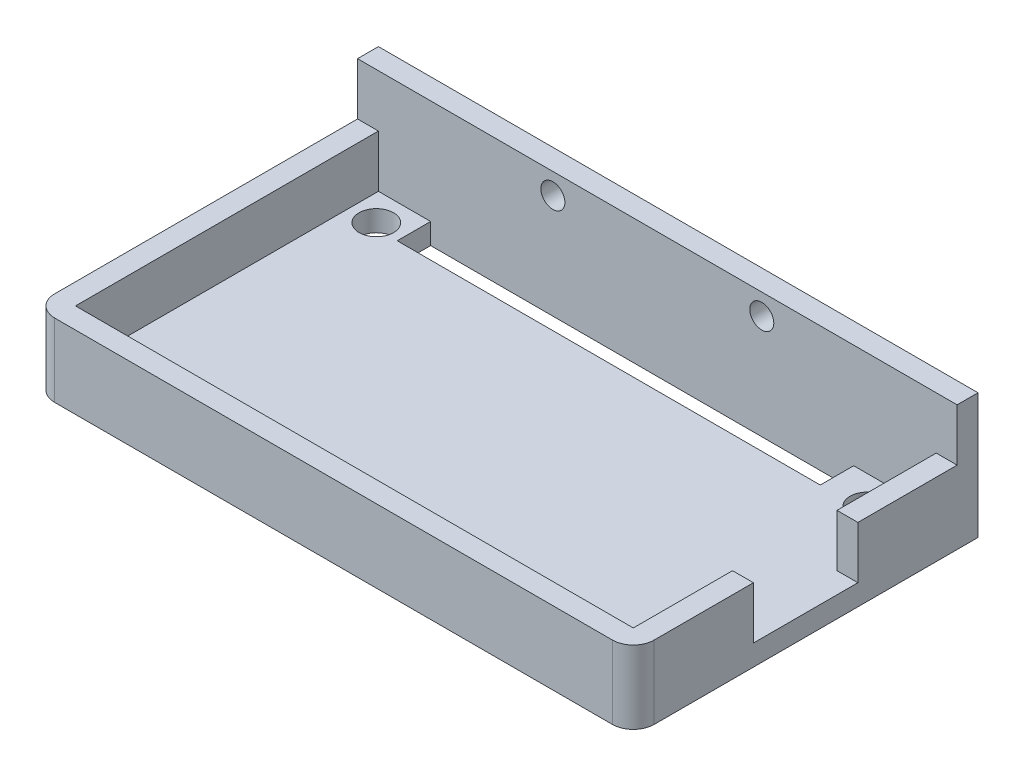
ISO-10303-21;
HEADER;
FILE_DESCRIPTION(('STEP AP214'),'2;1');
FILE_NAME('part.step','',(''),(''),'','','');
FILE_SCHEMA(('AUTOMOTIVE_DESIGN { 1 0 10303 214 1 1 1 1 }'));
ENDSEC;
DATA;
#1=APPLICATION_CONTEXT('core data for automotive mechanical design processes');
#2=APPLICATION_PROTOCOL_DEFINITION('international standard','automotive_design',2000,#1);
#3=PRODUCT_CONTEXT('',#1,'mechanical');
#4=PRODUCT('Part','Part','',(#3));
#5=PRODUCT_RELATED_PRODUCT_CATEGORY('part','',(#4));
#6=PRODUCT_DEFINITION_FORMATION('','',#4);
#7=PRODUCT_DEFINITION_CONTEXT('part definition',#1,'design');
#8=PRODUCT_DEFINITION('design','',#6,#7);
#9=PRODUCT_DEFINITION_SHAPE('','',#8);
#10=(LENGTH_UNIT() NAMED_UNIT(*) SI_UNIT(.MILLI.,.METRE.));
#11=(NAMED_UNIT(*) PLANE_ANGLE_UNIT() SI_UNIT($,.RADIAN.));
#12=(NAMED_UNIT(*) SI_UNIT($,.STERADIAN.) SOLID_ANGLE_UNIT());
#13=UNCERTAINTY_MEASURE_WITH_UNIT(LENGTH_MEASURE(1.E-05),#10,'distance_accuracy_value','');
#14=(GEOMETRIC_REPRESENTATION_CONTEXT(3) GLOBAL_UNCERTAINTY_ASSIGNED_CONTEXT((#13)) GLOBAL_UNIT_ASSIGNED_CONTEXT((#10,
#11,#12)) REPRESENTATION_CONTEXT('',''));
#15=CARTESIAN_POINT('',(0.,0.,0.));
#16=DIRECTION('',(0.,0.,1.));
#17=DIRECTION('',(1.,0.,0.));
#18=AXIS2_PLACEMENT_3D('',#15,#16,#17);
#19=CARTESIAN_POINT('',(0.,7.,0.));
#20=DIRECTION('',(0.,-1.,0.));
#21=DIRECTION('',(0.,0.,-1.));
#22=AXIS2_PLACEMENT_3D('',#19,#20,#21);
#23=PLANE('',#22);
#24=DIRECTION('',(0.,0.,1.));
#25=VECTOR('',#24,1.);
#26=CARTESIAN_POINT('',(0.,7.,0.));
#27=LINE('',#26,#25);
#28=CARTESIAN_POINT('',(0.,7.,-31.));
#29=VERTEX_POINT('',#28);
#30=CARTESIAN_POINT('',(0.,7.,-2.));
#31=VERTEX_POINT('',#30);
#32=EDGE_CURVE('E232',#29,#31,#27,.T.);
#33=ORIENTED_EDGE('',*,*,#32,.T.);
#34=CARTESIAN_POINT('',(2.,7.,-2.));
#35=DIRECTION('',(0.,-1.,0.));
#36=DIRECTION('',(0.,0.,-1.));
#37=AXIS2_PLACEMENT_3D('',#34,#35,#36);
#38=CIRCLE('',#37,2.);
#39=CARTESIAN_POINT('',(2.,7.,0.));
#40=VERTEX_POINT('',#39);
#41=EDGE_CURVE('E51',#31,#40,#38,.F.);
#42=ORIENTED_EDGE('',*,*,#41,.T.);
#43=DIRECTION('',(1.,0.,0.));
#44=VECTOR('',#43,1.);
#45=CARTESIAN_POINT('',(0.,7.,0.));
#46=LINE('',#45,#44);
#47=CARTESIAN_POINT('',(55.4,7.,0.));
#48=VERTEX_POINT('',#47);
#49=EDGE_CURVE('E379',#40,#48,#46,.T.);
#50=ORIENTED_EDGE('',*,*,#49,.T.);
#51=CARTESIAN_POINT('',(55.4,7.,-2.));
#52=DIRECTION('',(0.,-1.,0.));
#53=DIRECTION('',(0.,0.,-1.));
#54=AXIS2_PLACEMENT_3D('',#51,#52,#53);
#55=CIRCLE('',#54,2.);
#56=CARTESIAN_POINT('',(57.4,7.,-2.));
#57=VERTEX_POINT('',#56);
#58=EDGE_CURVE('E58',#48,#57,#55,.F.);
#59=ORIENTED_EDGE('',*,*,#58,.T.);
#60=DIRECTION('',(0.,0.,-1.));
#61=VECTOR('',#60,1.);
#62=CARTESIAN_POINT('',(57.4,7.,0.));
#63=LINE('',#62,#61);
#64=CARTESIAN_POINT('',(57.4,7.,-11.5));
#65=VERTEX_POINT('',#64);
#66=EDGE_CURVE('E383',#57,#65,#63,.T.);
#67=ORIENTED_EDGE('',*,*,#66,.T.);
#68=DIRECTION('',(1.,0.,0.));
#69=VECTOR('',#68,1.);
#70=CARTESIAN_POINT('',(55.4,7.,-11.5));
#71=LINE('',#70,#69);
#72=CARTESIAN_POINT('',(55.4,7.,-11.5));
#73=VERTEX_POINT('',#72);
#74=EDGE_CURVE('E233',#73,#65,#71,.T.);
#75=ORIENTED_EDGE('',*,*,#74,.F.);
#76=DIRECTION('',(0.,0.,-1.));
#77=VECTOR('',#76,1.);
#78=CARTESIAN_POINT('',(55.4,7.,0.));
#79=LINE('',#78,#77);
#80=CARTESIAN_POINT('',(55.4,7.,-2.));
#81=VERTEX_POINT('',#80);
#82=EDGE_CURVE('E355',#81,#73,#79,.T.);
#83=ORIENTED_EDGE('',*,*,#82,.F.);
#84=DIRECTION('',(1.,0.,0.));
#85=VECTOR('',#84,1.);
#86=CARTESIAN_POINT('',(0.,7.,-2.));
#87=LINE('',#86,#85);
#88=CARTESIAN_POINT('',(2.,7.,-2.));
#89=VERTEX_POINT('',#88);
#90=EDGE_CURVE('E373',#89,#81,#87,.T.);
#91=ORIENTED_EDGE('',*,*,#90,.F.);
#92=DIRECTION('',(0.,0.,1.));
#93=VECTOR('',#92,1.);
#94=CARTESIAN_POINT('',(2.,7.,0.));
#95=LINE('',#94,#93);
#96=CARTESIAN_POINT('',(2.,7.,-31.));
#97=VERTEX_POINT('',#96);
#98=EDGE_CURVE('E371',#97,#89,#95,.T.);
#99=ORIENTED_EDGE('',*,*,#98,.F.);
#100=DIRECTION('',(1.,0.,0.));
#101=VECTOR('',#100,1.);
#102=CARTESIAN_POINT('',(0.,7.,-31.));
#103=LINE('',#102,#101);
#104=EDGE_CURVE('E229',#29,#97,#103,.T.);
#105=ORIENTED_EDGE('',*,*,#104,.F.);
#106=EDGE_LOOP('',(#33,#42,#50,#59,#67,#75,#83,#91,#99,#105));
#107=FACE_BOUND('',#106,.T.);
#108=ADVANCED_FACE('F43',(#107),#23,.F.);
#109=CARTESIAN_POINT('',(55.4,7.,-31.));
#110=VERTEX_POINT('',#109);
#111=CARTESIAN_POINT('',(57.4,7.,-31.));
#112=VERTEX_POINT('',#111);
#113=EDGE_CURVE('E397',#110,#112,#103,.T.);
#114=ORIENTED_EDGE('',*,*,#113,.F.);
#115=CARTESIAN_POINT('',(55.4,7.,-21.5));
#116=VERTEX_POINT('',#115);
#117=EDGE_CURVE('E375',#116,#110,#79,.T.);
#118=ORIENTED_EDGE('',*,*,#117,.F.);
#119=DIRECTION('',(-1.,0.,0.));
#120=VECTOR('',#119,1.);
#121=CARTESIAN_POINT('',(55.4,7.,-21.5));
#122=LINE('',#121,#120);
#123=CARTESIAN_POINT('',(57.4,7.,-21.5));
#124=VERTEX_POINT('',#123);
#125=EDGE_CURVE('E236',#124,#116,#122,.T.);
#126=ORIENTED_EDGE('',*,*,#125,.F.);
#127=EDGE_CURVE('E382',#124,#112,#63,.T.);
#128=ORIENTED_EDGE('',*,*,#127,.T.);
#129=EDGE_LOOP('',(#114,#118,#126,#128));
#130=FACE_BOUND('',#129,.T.);
#131=ADVANCED_FACE('F434',(#130),#23,.F.);
#132=CARTESIAN_POINT('',(55.4,7.,0.));
#133=DIRECTION('',(-1.,0.,0.));
#134=DIRECTION('',(0.,0.,1.));
#135=AXIS2_PLACEMENT_3D('',#132,#133,#134);
#136=PLANE('',#135);
#137=DIRECTION('',(0.,1.,0.));
#138=VECTOR('',#137,1.);
#139=CARTESIAN_POINT('',(55.4,-8.19803902718557,-11.5));
#140=LINE('',#139,#138);
#141=CARTESIAN_POINT('',(55.4,2.,-11.5));
#142=VERTEX_POINT('',#141);
#143=EDGE_CURVE('E255',#142,#73,#140,.T.);
#144=ORIENTED_EDGE('',*,*,#143,.F.);
#145=DIRECTION('',(0.,0.,-1.));
#146=VECTOR('',#145,1.);
#147=CARTESIAN_POINT('',(55.4,2.,0.));
#148=LINE('',#147,#146);
#149=CARTESIAN_POINT('',(55.4,2.,-2.));
#150=VERTEX_POINT('',#149);
#151=EDGE_CURVE('E362',#150,#142,#148,.T.);
#152=ORIENTED_EDGE('',*,*,#151,.F.);
#153=DIRECTION('',(0.,-1.,0.));
#154=VECTOR('',#153,1.);
#155=CARTESIAN_POINT('',(55.4,7.,-2.));
#156=LINE('',#155,#154);
#157=EDGE_CURVE('E350',#81,#150,#156,.T.);
#158=ORIENTED_EDGE('',*,*,#157,.F.);
#159=ORIENTED_EDGE('',*,*,#82,.T.);
#160=EDGE_LOOP('',(#144,#152,#158,#159));
#161=FACE_BOUND('',#160,.T.);
#162=ADVANCED_FACE('F441',(#161),#136,.T.);
#163=CARTESIAN_POINT('',(0.,7.,0.));
#164=DIRECTION('',(1.,0.,0.));
#165=DIRECTION('',(0.,0.,-1.));
#166=AXIS2_PLACEMENT_3D('',#163,#164,#165);
#167=PLANE('',#166);
#168=DIRECTION('',(0.,0.,1.));
#169=VECTOR('',#168,1.);
#170=CARTESIAN_POINT('',(0.,0.,0.));
#171=LINE('',#170,#169);
#172=CARTESIAN_POINT('',(0.,0.,-33.));
#173=VERTEX_POINT('',#172);
#174=CARTESIAN_POINT('',(0.,0.,-2.));
#175=VERTEX_POINT('',#174);
#176=EDGE_CURVE('E349',#173,#175,#171,.T.);
#177=ORIENTED_EDGE('',*,*,#176,.T.);
#178=DIRECTION('',(0.,-1.,0.));
#179=VECTOR('',#178,1.);
#180=CARTESIAN_POINT('',(0.,7.,-2.));
#181=LINE('',#180,#179);
#182=EDGE_CURVE('E66',#175,#31,#181,.F.);
#183=ORIENTED_EDGE('',*,*,#182,.T.);
#184=ORIENTED_EDGE('',*,*,#32,.F.);
#185=DIRECTION('',(0.,-1.,0.));
#186=VECTOR('',#185,1.);
#187=CARTESIAN_POINT('',(0.,12.,-31.));
#188=LINE('',#187,#186);
#189=CARTESIAN_POINT('',(0.,12.,-31.));
#190=VERTEX_POINT('',#189);
#191=EDGE_CURVE('E213',#190,#29,#188,.T.);
#192=ORIENTED_EDGE('',*,*,#191,.F.);
#193=DIRECTION('',(0.,0.,1.));
#194=VECTOR('',#193,1.);
#195=CARTESIAN_POINT('',(0.,12.,-33.));
#196=LINE('',#195,#194);
#197=CARTESIAN_POINT('',(0.,12.,-33.));
#198=VERTEX_POINT('',#197);
#199=EDGE_CURVE('E221',#198,#190,#196,.T.);
#200=ORIENTED_EDGE('',*,*,#199,.F.);
#201=DIRECTION('',(0.,-1.,0.));
#202=VECTOR('',#201,1.);
#203=CARTESIAN_POINT('',(0.,7.,-33.));
#204=LINE('',#203,#202);
#205=EDGE_CURVE('E385',#198,#173,#204,.T.);
#206=ORIENTED_EDGE('',*,*,#205,.T.);
#207=EDGE_LOOP('',(#177,#183,#184,#192,#200,#206));
#208=FACE_BOUND('',#207,.T.);
#209=ADVANCED_FACE('F231',(#208),#167,.F.);
#210=CARTESIAN_POINT('',(0.,7.,0.));
#211=DIRECTION('',(0.,0.,-1.));
#212=DIRECTION('',(-1.,0.,0.));
#213=AXIS2_PLACEMENT_3D('',#210,#211,#212);
#214=PLANE('',#213);
#215=ORIENTED_EDGE('',*,*,#49,.F.);
#216=DIRECTION('',(0.,-1.,0.));
#217=VECTOR('',#216,1.);
#218=CARTESIAN_POINT('',(2.,7.,0.));
#219=LINE('',#218,#217);
#220=CARTESIAN_POINT('',(2.,0.,0.));
#221=VERTEX_POINT('',#220);
#222=EDGE_CURVE('E400',#40,#221,#219,.T.);
#223=ORIENTED_EDGE('',*,*,#222,.T.);
#224=DIRECTION('',(1.,0.,0.));
#225=VECTOR('',#224,1.);
#226=CARTESIAN_POINT('',(0.,0.,0.));
#227=LINE('',#226,#225);
#228=CARTESIAN_POINT('',(55.4,0.,0.));
#229=VERTEX_POINT('',#228);
#230=EDGE_CURVE('E387',#221,#229,#227,.T.);
#231=ORIENTED_EDGE('',*,*,#230,.T.);
#232=DIRECTION('',(0.,-1.,0.));
#233=VECTOR('',#232,1.);
#234=CARTESIAN_POINT('',(55.4,7.,0.));
#235=LINE('',#234,#233);
#236=EDGE_CURVE('E398',#229,#48,#235,.F.);
#237=ORIENTED_EDGE('',*,*,#236,.T.);
#238=EDGE_LOOP('',(#215,#223,#231,#237));
#239=FACE_BOUND('',#238,.T.);
#240=ADVANCED_FACE('F413',(#239),#214,.F.);
#241=CARTESIAN_POINT('',(57.4,7.,0.));
#242=DIRECTION('',(-1.,0.,0.));
#243=DIRECTION('',(0.,0.,1.));
#244=AXIS2_PLACEMENT_3D('',#241,#242,#243);
#245=PLANE('',#244);
#246=ORIENTED_EDGE('',*,*,#66,.F.);
#247=DIRECTION('',(0.,-1.,0.));
#248=VECTOR('',#247,1.);
#249=CARTESIAN_POINT('',(57.4,7.,-2.));
#250=LINE('',#249,#248);
#251=CARTESIAN_POINT('',(57.4,0.,-2.));
#252=VERTEX_POINT('',#251);
#253=EDGE_CURVE('E11',#57,#252,#250,.T.);
#254=ORIENTED_EDGE('',*,*,#253,.T.);
#255=DIRECTION('',(0.,0.,-1.));
#256=VECTOR('',#255,1.);
#257=CARTESIAN_POINT('',(57.4,0.,0.));
#258=LINE('',#257,#256);
#259=CARTESIAN_POINT('',(57.4,0.,-33.));
#260=VERTEX_POINT('',#259);
#261=EDGE_CURVE('E390',#252,#260,#258,.T.);
#262=ORIENTED_EDGE('',*,*,#261,.T.);
#263=DIRECTION('',(0.,-1.,0.));
#264=VECTOR('',#263,1.);
#265=CARTESIAN_POINT('',(57.4,7.,-33.));
#266=LINE('',#265,#264);
#267=CARTESIAN_POINT('',(57.4,12.,-33.));
#268=VERTEX_POINT('',#267);
#269=EDGE_CURVE('E394',#268,#260,#266,.T.);
#270=ORIENTED_EDGE('',*,*,#269,.F.);
#271=DIRECTION('',(0.,0.,-1.));
#272=VECTOR('',#271,1.);
#273=CARTESIAN_POINT('',(57.4,12.,-33.));
#274=LINE('',#273,#272);
#275=CARTESIAN_POINT('',(57.4,12.,-31.));
#276=VERTEX_POINT('',#275);
#277=EDGE_CURVE('E220',#276,#268,#274,.T.);
#278=ORIENTED_EDGE('',*,*,#277,.F.);
#279=DIRECTION('',(0.,-1.,0.));
#280=VECTOR('',#279,1.);
#281=CARTESIAN_POINT('',(57.4,12.,-31.));
#282=LINE('',#281,#280);
#283=EDGE_CURVE('E216',#276,#112,#282,.T.);
#284=ORIENTED_EDGE('',*,*,#283,.T.);
#285=ORIENTED_EDGE('',*,*,#127,.F.);
#286=DIRECTION('',(0.,1.,0.));
#287=VECTOR('',#286,1.);
#288=CARTESIAN_POINT('',(57.4,-8.19803902718557,-21.5));
#289=LINE('',#288,#287);
#290=CARTESIAN_POINT('',(57.4,2.,-21.5));
#291=VERTEX_POINT('',#290);
#292=EDGE_CURVE('E249',#291,#124,#289,.T.);
#293=ORIENTED_EDGE('',*,*,#292,.F.);
#294=DIRECTION('',(0.,0.,-1.));
#295=VECTOR('',#294,1.);
#296=CARTESIAN_POINT('',(57.4,2.,-21.5));
#297=LINE('',#296,#295);
#298=CARTESIAN_POINT('',(57.4,2.,-11.5));
#299=VERTEX_POINT('',#298);
#300=EDGE_CURVE('E250',#299,#291,#297,.T.);
#301=ORIENTED_EDGE('',*,*,#300,.F.);
#302=DIRECTION('',(0.,1.,0.));
#303=VECTOR('',#302,1.);
#304=CARTESIAN_POINT('',(57.4,-8.19803902718557,-11.5));
#305=LINE('',#304,#303);
#306=EDGE_CURVE('E245',#299,#65,#305,.T.);
#307=ORIENTED_EDGE('',*,*,#306,.T.);
#308=EDGE_LOOP('',(#246,#254,#262,#270,#278,#284,#285,#293,#301,#307));
#309=FACE_BOUND('',#308,.T.);
#310=ADVANCED_FACE('F425',(#309),#245,.F.);
#311=CARTESIAN_POINT('',(0.,7.,-33.));
#312=DIRECTION('',(0.,0.,1.));
#313=DIRECTION('',(1.,0.,0.));
#314=AXIS2_PLACEMENT_3D('',#311,#312,#313);
#315=PLANE('',#314);
#316=CARTESIAN_POINT('',(38.7,10.,-33.));
#317=DIRECTION('',(0.,0.,-1.));
#318=DIRECTION('',(-1.,0.,0.));
#319=AXIS2_PLACEMENT_3D('',#316,#317,#318);
#320=CIRCLE('',#319,1.15);
#321=CARTESIAN_POINT('',(37.55,10.,-33.));
#322=VERTEX_POINT('',#321);
#323=EDGE_CURVE('E490',#322,#322,#320,.T.);
#324=ORIENTED_EDGE('',*,*,#323,.F.);
#325=EDGE_LOOP('',(#324));
#326=FACE_BOUND('',#325,.T.);
#327=CARTESIAN_POINT('',(18.7,10.,-33.));
#328=DIRECTION('',(0.,0.,-1.));
#329=DIRECTION('',(-1.,0.,0.));
#330=AXIS2_PLACEMENT_3D('',#327,#328,#329);
#331=CIRCLE('',#330,1.15);
#332=CARTESIAN_POINT('',(17.55,10.,-33.));
#333=VERTEX_POINT('',#332);
#334=EDGE_CURVE('E502',#333,#333,#331,.T.);
#335=ORIENTED_EDGE('',*,*,#334,.F.);
#336=EDGE_LOOP('',(#335));
#337=FACE_BOUND('',#336,.T.);
#338=DIRECTION('',(-1.,0.,0.));
#339=VECTOR('',#338,1.);
#340=CARTESIAN_POINT('',(0.,0.,-33.));
#341=LINE('',#340,#339);
#342=EDGE_CURVE('E380',#260,#173,#341,.T.);
#343=ORIENTED_EDGE('',*,*,#342,.T.);
#344=ORIENTED_EDGE('',*,*,#205,.F.);
#345=DIRECTION('',(-1.,0.,0.));
#346=VECTOR('',#345,1.);
#347=CARTESIAN_POINT('',(0.,12.,-33.));
#348=LINE('',#347,#346);
#349=EDGE_CURVE('E227',#268,#198,#348,.T.);
#350=ORIENTED_EDGE('',*,*,#349,.F.);
#351=ORIENTED_EDGE('',*,*,#269,.T.);
#352=EDGE_LOOP('',(#343,#344,#350,#351));
#353=FACE_BOUND('',#352,.T.);
#354=ADVANCED_FACE('F422',(#326,#337,#353),#315,.F.);
#355=CARTESIAN_POINT('',(0.,0.,0.));
#356=DIRECTION('',(0.,-1.,0.));
#357=DIRECTION('',(0.,0.,-1.));
#358=AXIS2_PLACEMENT_3D('',#355,#356,#357);
#359=PLANE('',#358);
#360=DIRECTION('',(0.,0.,1.));
#361=VECTOR('',#360,1.);
#362=CARTESIAN_POINT('',(7.,0.,-31.));
#363=LINE('',#362,#361);
#364=CARTESIAN_POINT('',(7.,0.,-31.));
#365=VERTEX_POINT('',#364);
#366=CARTESIAN_POINT('',(7.,0.,-27.8));
#367=VERTEX_POINT('',#366);
#368=EDGE_CURVE('E261',#365,#367,#363,.T.);
#369=ORIENTED_EDGE('',*,*,#368,.T.);
#370=DIRECTION('',(1.,0.,0.));
#371=VECTOR('',#370,1.);
#372=CARTESIAN_POINT('',(7.,0.,-27.8));
#373=LINE('',#372,#371);
#374=CARTESIAN_POINT('',(47.5,0.,-27.8));
#375=VERTEX_POINT('',#374);
#376=EDGE_CURVE('E264',#367,#375,#373,.T.);
#377=ORIENTED_EDGE('',*,*,#376,.T.);
#378=DIRECTION('',(0.,0.,-1.));
#379=VECTOR('',#378,1.);
#380=CARTESIAN_POINT('',(47.5,0.,-31.));
#381=LINE('',#380,#379);
#382=CARTESIAN_POINT('',(47.5,0.,-31.));
#383=VERTEX_POINT('',#382);
#384=EDGE_CURVE('E268',#375,#383,#381,.T.);
#385=ORIENTED_EDGE('',*,*,#384,.T.);
#386=DIRECTION('',(-1.,0.,0.));
#387=VECTOR('',#386,1.);
#388=CARTESIAN_POINT('',(7.,0.,-31.));
#389=LINE('',#388,#387);
#390=EDGE_CURVE('E271',#383,#365,#389,.T.);
#391=ORIENTED_EDGE('',*,*,#390,.T.);
#392=EDGE_LOOP('',(#369,#377,#385,#391));
#393=FACE_BOUND('',#392,.T.);
#394=DIRECTION('',(1.,0.,0.));
#395=VECTOR('',#394,1.);
#396=CARTESIAN_POINT('',(7.,0.,-2.));
#397=LINE('',#396,#395);
#398=CARTESIAN_POINT('',(7.,0.,-2.));
#399=VERTEX_POINT('',#398);
#400=CARTESIAN_POINT('',(47.5,0.,-2.));
#401=VERTEX_POINT('',#400);
#402=EDGE_CURVE('E304',#399,#401,#397,.T.);
#403=ORIENTED_EDGE('',*,*,#402,.T.);
#404=DIRECTION('',(0.,0.,-1.));
#405=VECTOR('',#404,1.);
#406=CARTESIAN_POINT('',(47.5,0.,-2.));
#407=LINE('',#406,#405);
#408=CARTESIAN_POINT('',(47.5,0.,-5.2));
#409=VERTEX_POINT('',#408);
#410=EDGE_CURVE('E314',#401,#409,#407,.T.);
#411=ORIENTED_EDGE('',*,*,#410,.T.);
#412=DIRECTION('',(-1.,0.,0.));
#413=VECTOR('',#412,1.);
#414=CARTESIAN_POINT('',(7.,0.,-5.2));
#415=LINE('',#414,#413);
#416=CARTESIAN_POINT('',(7.,0.,-5.2));
#417=VERTEX_POINT('',#416);
#418=EDGE_CURVE('E311',#409,#417,#415,.T.);
#419=ORIENTED_EDGE('',*,*,#418,.T.);
#420=DIRECTION('',(0.,0.,1.));
#421=VECTOR('',#420,1.);
#422=CARTESIAN_POINT('',(7.,0.,-2.));
#423=LINE('',#422,#421);
#424=EDGE_CURVE('E294',#417,#399,#423,.T.);
#425=ORIENTED_EDGE('',*,*,#424,.T.);
#426=EDGE_LOOP('',(#403,#411,#419,#425));
#427=FACE_BOUND('',#426,.T.);
#428=CARTESIAN_POINT('',(51.5,0.,-28.3));
#429=DIRECTION('',(0.,1.,0.));
#430=DIRECTION('',(0.,0.,1.));
#431=AXIS2_PLACEMENT_3D('',#428,#429,#430);
#432=CIRCLE('',#431,1.65);
#433=CARTESIAN_POINT('',(51.5,0.,-26.65));
#434=VERTEX_POINT('',#433);
#435=EDGE_CURVE('E329',#434,#434,#432,.T.);
#436=ORIENTED_EDGE('',*,*,#435,.T.);
#437=EDGE_LOOP('',(#436));
#438=FACE_BOUND('',#437,.T.);
#439=CARTESIAN_POINT('',(4.5,0.,-4.7));
#440=DIRECTION('',(0.,1.,0.));
#441=DIRECTION('',(0.,0.,1.));
#442=AXIS2_PLACEMENT_3D('',#439,#440,#441);
#443=CIRCLE('',#442,1.65);
#444=CARTESIAN_POINT('',(4.5,0.,-3.05));
#445=VERTEX_POINT('',#444);
#446=EDGE_CURVE('E322',#445,#445,#443,.T.);
#447=ORIENTED_EDGE('',*,*,#446,.T.);
#448=EDGE_LOOP('',(#447));
#449=FACE_BOUND('',#448,.T.);
#450=CARTESIAN_POINT('',(51.5,0.,-4.7));
#451=DIRECTION('',(0.,1.,0.));
#452=DIRECTION('',(0.,0.,1.));
#453=AXIS2_PLACEMENT_3D('',#450,#451,#452);
#454=CIRCLE('',#453,1.65);
#455=CARTESIAN_POINT('',(51.5,0.,-3.05));
#456=VERTEX_POINT('',#455);
#457=EDGE_CURVE('E285',#456,#456,#454,.T.);
#458=ORIENTED_EDGE('',*,*,#457,.T.);
#459=EDGE_LOOP('',(#458));
#460=FACE_BOUND('',#459,.T.);
#461=CARTESIAN_POINT('',(4.5,0.,-28.3));
#462=DIRECTION('',(0.,1.,0.));
#463=DIRECTION('',(0.,0.,1.));
#464=AXIS2_PLACEMENT_3D('',#461,#462,#463);
#465=CIRCLE('',#464,1.65);
#466=CARTESIAN_POINT('',(4.5,0.,-26.65));
#467=VERTEX_POINT('',#466);
#468=EDGE_CURVE('E337',#467,#467,#465,.T.);
#469=ORIENTED_EDGE('',*,*,#468,.T.);
#470=EDGE_LOOP('',(#469));
#471=FACE_BOUND('',#470,.T.);
#472=ORIENTED_EDGE('',*,*,#230,.F.);
#473=CARTESIAN_POINT('',(2.,0.,-2.));
#474=DIRECTION('',(0.,-1.,0.));
#475=DIRECTION('',(0.,0.,-1.));
#476=AXIS2_PLACEMENT_3D('',#473,#474,#475);
#477=CIRCLE('',#476,2.);
#478=EDGE_CURVE('E405',#221,#175,#477,.T.);
#479=ORIENTED_EDGE('',*,*,#478,.T.);
#480=ORIENTED_EDGE('',*,*,#176,.F.);
#481=ORIENTED_EDGE('',*,*,#342,.F.);
#482=ORIENTED_EDGE('',*,*,#261,.F.);
#483=CARTESIAN_POINT('',(55.4,0.,-2.));
#484=DIRECTION('',(0.,-1.,0.));
#485=DIRECTION('',(0.,0.,-1.));
#486=AXIS2_PLACEMENT_3D('',#483,#484,#485);
#487=CIRCLE('',#486,2.);
#488=EDGE_CURVE('E403',#252,#229,#487,.T.);
#489=ORIENTED_EDGE('',*,*,#488,.T.);
#490=EDGE_LOOP('',(#472,#479,#480,#481,#482,#489));
#491=FACE_BOUND('',#490,.T.);
#492=ADVANCED_FACE('F419',(#393,#427,#438,#449,#460,#471,#491),#359,.T.);
#493=CARTESIAN_POINT('',(2.,7.,0.));
#494=DIRECTION('',(1.,0.,0.));
#495=DIRECTION('',(0.,0.,-1.));
#496=AXIS2_PLACEMENT_3D('',#493,#494,#495);
#497=PLANE('',#496);
#498=DIRECTION('',(0.,0.,1.));
#499=VECTOR('',#498,1.);
#500=CARTESIAN_POINT('',(2.,2.,0.));
#501=LINE('',#500,#499);
#502=CARTESIAN_POINT('',(2.,2.,-31.));
#503=VERTEX_POINT('',#502);
#504=CARTESIAN_POINT('',(2.,2.,-2.));
#505=VERTEX_POINT('',#504);
#506=EDGE_CURVE('E340',#503,#505,#501,.T.);
#507=ORIENTED_EDGE('',*,*,#506,.F.);
#508=DIRECTION('',(0.,-1.,0.));
#509=VECTOR('',#508,1.);
#510=CARTESIAN_POINT('',(2.,7.,-31.));
#511=LINE('',#510,#509);
#512=EDGE_CURVE('E351',#97,#503,#511,.T.);
#513=ORIENTED_EDGE('',*,*,#512,.F.);
#514=ORIENTED_EDGE('',*,*,#98,.T.);
#515=DIRECTION('',(0.,-1.,0.));
#516=VECTOR('',#515,1.);
#517=CARTESIAN_POINT('',(2.,7.,-2.));
#518=LINE('',#517,#516);
#519=EDGE_CURVE('E346',#89,#505,#518,.T.);
#520=ORIENTED_EDGE('',*,*,#519,.T.);
#521=EDGE_LOOP('',(#507,#513,#514,#520));
#522=FACE_BOUND('',#521,.T.);
#523=ADVANCED_FACE('F449',(#522),#497,.T.);
#524=CARTESIAN_POINT('',(0.,7.,-2.));
#525=DIRECTION('',(0.,0.,-1.));
#526=DIRECTION('',(-1.,0.,0.));
#527=AXIS2_PLACEMENT_3D('',#524,#525,#526);
#528=PLANE('',#527);
#529=DIRECTION('',(1.,0.,0.));
#530=VECTOR('',#529,1.);
#531=CARTESIAN_POINT('',(0.,2.,-2.));
#532=LINE('',#531,#530);
#533=CARTESIAN_POINT('',(7.,2.,-2.));
#534=VERTEX_POINT('',#533);
#535=EDGE_CURVE('E356',#505,#534,#532,.T.);
#536=ORIENTED_EDGE('',*,*,#535,.F.);
#537=ORIENTED_EDGE('',*,*,#519,.F.);
#538=ORIENTED_EDGE('',*,*,#90,.T.);
#539=ORIENTED_EDGE('',*,*,#157,.T.);
#540=CARTESIAN_POINT('',(47.5,2.,-2.));
#541=VERTEX_POINT('',#540);
#542=EDGE_CURVE('E345',#541,#150,#532,.T.);
#543=ORIENTED_EDGE('',*,*,#542,.F.);
#544=DIRECTION('',(0.,1.,0.));
#545=VECTOR('',#544,1.);
#546=CARTESIAN_POINT('',(47.5,0.,-2.));
#547=LINE('',#546,#545);
#548=EDGE_CURVE('E292',#401,#541,#547,.T.);
#549=ORIENTED_EDGE('',*,*,#548,.F.);
#550=ORIENTED_EDGE('',*,*,#402,.F.);
#551=DIRECTION('',(0.,1.,0.));
#552=VECTOR('',#551,1.);
#553=CARTESIAN_POINT('',(7.,0.,-2.));
#554=LINE('',#553,#552);
#555=EDGE_CURVE('E260',#399,#534,#554,.T.);
#556=ORIENTED_EDGE('',*,*,#555,.T.);
#557=EDGE_LOOP('',(#536,#537,#538,#539,#543,#549,#550,#556));
#558=FACE_BOUND('',#557,.T.);
#559=ADVANCED_FACE('F471',(#558),#528,.T.);
#560=DIRECTION('',(0.,1.,0.));
#561=VECTOR('',#560,1.);
#562=CARTESIAN_POINT('',(55.4,-8.19803902718557,-21.5));
#563=LINE('',#562,#561);
#564=CARTESIAN_POINT('',(55.4,2.,-21.5));
#565=VERTEX_POINT('',#564);
#566=EDGE_CURVE('E248',#565,#116,#563,.T.);
#567=ORIENTED_EDGE('',*,*,#566,.T.);
#568=ORIENTED_EDGE('',*,*,#117,.T.);
#569=DIRECTION('',(0.,-1.,0.));
#570=VECTOR('',#569,1.);
#571=CARTESIAN_POINT('',(55.4,7.,-31.));
#572=LINE('',#571,#570);
#573=CARTESIAN_POINT('',(55.4,2.,-31.));
#574=VERTEX_POINT('',#573);
#575=EDGE_CURVE('E354',#110,#574,#572,.T.);
#576=ORIENTED_EDGE('',*,*,#575,.T.);
#577=EDGE_CURVE('E359',#565,#574,#148,.T.);
#578=ORIENTED_EDGE('',*,*,#577,.F.);
#579=EDGE_LOOP('',(#567,#568,#576,#578));
#580=FACE_BOUND('',#579,.T.);
#581=ADVANCED_FACE('F463',(#580),#136,.T.);
#582=CARTESIAN_POINT('',(0.,7.,-31.));
#583=DIRECTION('',(0.,0.,1.));
#584=DIRECTION('',(1.,0.,0.));
#585=AXIS2_PLACEMENT_3D('',#582,#583,#584);
#586=PLANE('',#585);
#587=CARTESIAN_POINT('',(38.7,10.,-31.));
#588=DIRECTION('',(0.,0.,1.));
#589=DIRECTION('',(1.,0.,0.));
#590=AXIS2_PLACEMENT_3D('',#587,#588,#589);
#591=CIRCLE('',#590,1.15);
#592=CARTESIAN_POINT('',(39.85,10.,-31.));
#593=VERTEX_POINT('',#592);
#594=EDGE_CURVE('E492',#593,#593,#591,.F.);
#595=ORIENTED_EDGE('',*,*,#594,.T.);
#596=EDGE_LOOP('',(#595));
#597=FACE_BOUND('',#596,.T.);
#598=CARTESIAN_POINT('',(18.7,10.,-31.));
#599=DIRECTION('',(0.,0.,1.));
#600=DIRECTION('',(1.,0.,0.));
#601=AXIS2_PLACEMENT_3D('',#598,#599,#600);
#602=CIRCLE('',#601,1.15);
#603=CARTESIAN_POINT('',(19.85,10.,-31.));
#604=VERTEX_POINT('',#603);
#605=EDGE_CURVE('E497',#604,#604,#602,.F.);
#606=ORIENTED_EDGE('',*,*,#605,.T.);
#607=EDGE_LOOP('',(#606));
#608=FACE_BOUND('',#607,.T.);
#609=DIRECTION('',(-1.,0.,0.));
#610=VECTOR('',#609,1.);
#611=CARTESIAN_POINT('',(0.,2.,-31.));
#612=LINE('',#611,#610);
#613=CARTESIAN_POINT('',(47.5,2.,-31.));
#614=VERTEX_POINT('',#613);
#615=EDGE_CURVE('E368',#574,#614,#612,.T.);
#616=ORIENTED_EDGE('',*,*,#615,.F.);
#617=ORIENTED_EDGE('',*,*,#575,.F.);
#618=ORIENTED_EDGE('',*,*,#113,.T.);
#619=ORIENTED_EDGE('',*,*,#283,.F.);
#620=DIRECTION('',(1.,0.,0.));
#621=VECTOR('',#620,1.);
#622=CARTESIAN_POINT('',(0.,12.,-31.));
#623=LINE('',#622,#621);
#624=EDGE_CURVE('E207',#190,#276,#623,.T.);
#625=ORIENTED_EDGE('',*,*,#624,.F.);
#626=ORIENTED_EDGE('',*,*,#191,.T.);
#627=ORIENTED_EDGE('',*,*,#104,.T.);
#628=ORIENTED_EDGE('',*,*,#512,.T.);
#629=CARTESIAN_POINT('',(7.,2.,-31.));
#630=VERTEX_POINT('',#629);
#631=EDGE_CURVE('E365',#630,#503,#612,.T.);
#632=ORIENTED_EDGE('',*,*,#631,.F.);
#633=DIRECTION('',(0.,1.,0.));
#634=VECTOR('',#633,1.);
#635=CARTESIAN_POINT('',(7.,0.,-31.));
#636=LINE('',#635,#634);
#637=EDGE_CURVE('E283',#365,#630,#636,.T.);
#638=ORIENTED_EDGE('',*,*,#637,.F.);
#639=ORIENTED_EDGE('',*,*,#390,.F.);
#640=DIRECTION('',(0.,1.,0.));
#641=VECTOR('',#640,1.);
#642=CARTESIAN_POINT('',(47.5,0.,-31.));
#643=LINE('',#642,#641);
#644=EDGE_CURVE('E286',#383,#614,#643,.T.);
#645=ORIENTED_EDGE('',*,*,#644,.T.);
#646=EDGE_LOOP('',(#616,#617,#618,#619,#625,#626,#627,#628,#632,#638,#639,#645));
#647=FACE_BOUND('',#646,.T.);
#648=ADVANCED_FACE('F210',(#597,#608,#647),#586,.T.);
#649=CARTESIAN_POINT('',(0.,2.,0.));
#650=DIRECTION('',(0.,-1.,0.));
#651=DIRECTION('',(0.,0.,-1.));
#652=AXIS2_PLACEMENT_3D('',#649,#650,#651);
#653=PLANE('',#652);
#654=CARTESIAN_POINT('',(51.5,2.,-28.3));
#655=DIRECTION('',(0.,1.,0.));
#656=DIRECTION('',(0.,0.,1.));
#657=AXIS2_PLACEMENT_3D('',#654,#655,#656);
#658=CIRCLE('',#657,1.65);
#659=CARTESIAN_POINT('',(51.5,2.,-26.65));
#660=VERTEX_POINT('',#659);
#661=EDGE_CURVE('E325',#660,#660,#658,.T.);
#662=ORIENTED_EDGE('',*,*,#661,.F.);
#663=EDGE_LOOP('',(#662));
#664=FACE_BOUND('',#663,.T.);
#665=CARTESIAN_POINT('',(4.5,2.,-4.7));
#666=DIRECTION('',(0.,1.,0.));
#667=DIRECTION('',(0.,0.,1.));
#668=AXIS2_PLACEMENT_3D('',#665,#666,#667);
#669=CIRCLE('',#668,1.65);
#670=CARTESIAN_POINT('',(4.5,2.,-3.05));
#671=VERTEX_POINT('',#670);
#672=EDGE_CURVE('E332',#671,#671,#669,.T.);
#673=ORIENTED_EDGE('',*,*,#672,.F.);
#674=EDGE_LOOP('',(#673));
#675=FACE_BOUND('',#674,.T.);
#676=CARTESIAN_POINT('',(51.5,2.,-4.7));
#677=DIRECTION('',(0.,1.,0.));
#678=DIRECTION('',(0.,0.,1.));
#679=AXIS2_PLACEMENT_3D('',#676,#677,#678);
#680=CIRCLE('',#679,1.65);
#681=CARTESIAN_POINT('',(51.5,2.,-3.05));
#682=VERTEX_POINT('',#681);
#683=EDGE_CURVE('E319',#682,#682,#680,.T.);
#684=ORIENTED_EDGE('',*,*,#683,.F.);
#685=EDGE_LOOP('',(#684));
#686=FACE_BOUND('',#685,.T.);
#687=CARTESIAN_POINT('',(4.5,2.,-28.3));
#688=DIRECTION('',(0.,1.,0.));
#689=DIRECTION('',(0.,0.,1.));
#690=AXIS2_PLACEMENT_3D('',#687,#688,#689);
#691=CIRCLE('',#690,1.65);
#692=CARTESIAN_POINT('',(4.5,2.,-26.65));
#693=VERTEX_POINT('',#692);
#694=EDGE_CURVE('E328',#693,#693,#691,.T.);
#695=ORIENTED_EDGE('',*,*,#694,.F.);
#696=EDGE_LOOP('',(#695));
#697=FACE_BOUND('',#696,.T.);
#698=DIRECTION('',(1.,0.,0.));
#699=VECTOR('',#698,1.);
#700=CARTESIAN_POINT('',(7.,2.,-27.8));
#701=LINE('',#700,#699);
#702=CARTESIAN_POINT('',(7.,2.,-27.8));
#703=VERTEX_POINT('',#702);
#704=CARTESIAN_POINT('',(47.5,2.,-27.8));
#705=VERTEX_POINT('',#704);
#706=EDGE_CURVE('E277',#703,#705,#701,.T.);
#707=ORIENTED_EDGE('',*,*,#706,.F.);
#708=DIRECTION('',(0.,0.,1.));
#709=VECTOR('',#708,1.);
#710=CARTESIAN_POINT('',(7.,2.,-31.));
#711=LINE('',#710,#709);
#712=EDGE_CURVE('E275',#630,#703,#711,.T.);
#713=ORIENTED_EDGE('',*,*,#712,.F.);
#714=ORIENTED_EDGE('',*,*,#631,.T.);
#715=ORIENTED_EDGE('',*,*,#506,.T.);
#716=ORIENTED_EDGE('',*,*,#535,.T.);
#717=DIRECTION('',(0.,0.,1.));
#718=VECTOR('',#717,1.);
#719=CARTESIAN_POINT('',(7.,2.,-2.));
#720=LINE('',#719,#718);
#721=CARTESIAN_POINT('',(7.,2.,-5.2));
#722=VERTEX_POINT('',#721);
#723=EDGE_CURVE('E300',#722,#534,#720,.T.);
#724=ORIENTED_EDGE('',*,*,#723,.F.);
#725=DIRECTION('',(-1.,0.,0.));
#726=VECTOR('',#725,1.);
#727=CARTESIAN_POINT('',(7.,2.,-5.2));
#728=LINE('',#727,#726);
#729=CARTESIAN_POINT('',(47.5,2.,-5.2));
#730=VERTEX_POINT('',#729);
#731=EDGE_CURVE('E303',#730,#722,#728,.T.);
#732=ORIENTED_EDGE('',*,*,#731,.F.);
#733=DIRECTION('',(0.,0.,-1.));
#734=VECTOR('',#733,1.);
#735=CARTESIAN_POINT('',(47.5,2.,-2.));
#736=LINE('',#735,#734);
#737=EDGE_CURVE('E278',#541,#730,#736,.T.);
#738=ORIENTED_EDGE('',*,*,#737,.F.);
#739=ORIENTED_EDGE('',*,*,#542,.T.);
#740=ORIENTED_EDGE('',*,*,#151,.T.);
#741=DIRECTION('',(1.,0.,0.));
#742=VECTOR('',#741,1.);
#743=CARTESIAN_POINT('',(55.4,2.,-11.5));
#744=LINE('',#743,#742);
#745=EDGE_CURVE('E241',#142,#299,#744,.T.);
#746=ORIENTED_EDGE('',*,*,#745,.T.);
#747=ORIENTED_EDGE('',*,*,#300,.T.);
#748=DIRECTION('',(-1.,0.,0.));
#749=VECTOR('',#748,1.);
#750=CARTESIAN_POINT('',(55.4,2.,-21.5));
#751=LINE('',#750,#749);
#752=EDGE_CURVE('E246',#291,#565,#751,.T.);
#753=ORIENTED_EDGE('',*,*,#752,.T.);
#754=ORIENTED_EDGE('',*,*,#577,.T.);
#755=ORIENTED_EDGE('',*,*,#615,.T.);
#756=DIRECTION('',(0.,0.,-1.));
#757=VECTOR('',#756,1.);
#758=CARTESIAN_POINT('',(47.5,2.,-31.));
#759=LINE('',#758,#757);
#760=EDGE_CURVE('E265',#705,#614,#759,.T.);
#761=ORIENTED_EDGE('',*,*,#760,.F.);
#762=EDGE_LOOP('',(#707,#713,#714,#715,#716,#724,#732,#738,#739,#740,#746,#747,#753,#754,#755,#761));
#763=FACE_BOUND('',#762,.T.);
#764=ADVANCED_FACE('F445',(#664,#675,#686,#697,#763),#653,.F.);
#765=CARTESIAN_POINT('',(4.5,0.,-28.3));
#766=DIRECTION('',(0.,1.,0.));
#767=DIRECTION('',(0.,0.,1.));
#768=AXIS2_PLACEMENT_3D('',#765,#766,#767);
#769=CYLINDRICAL_SURFACE('',#768,1.65);
#770=ORIENTED_EDGE('',*,*,#468,.F.);
#771=EDGE_LOOP('',(#770));
#772=FACE_BOUND('',#771,.T.);
#773=ORIENTED_EDGE('',*,*,#694,.T.);
#774=EDGE_LOOP('',(#773));
#775=FACE_BOUND('',#774,.T.);
#776=ADVANCED_FACE('F564',(#772,#775),#769,.F.);
#777=CARTESIAN_POINT('',(51.5,0.,-4.7));
#778=DIRECTION('',(0.,1.,0.));
#779=DIRECTION('',(0.,0.,1.));
#780=AXIS2_PLACEMENT_3D('',#777,#778,#779);
#781=CYLINDRICAL_SURFACE('',#780,1.65);
#782=ORIENTED_EDGE('',*,*,#457,.F.);
#783=EDGE_LOOP('',(#782));
#784=FACE_BOUND('',#783,.T.);
#785=ORIENTED_EDGE('',*,*,#683,.T.);
#786=EDGE_LOOP('',(#785));
#787=FACE_BOUND('',#786,.T.);
#788=ADVANCED_FACE('F560',(#784,#787),#781,.F.);
#789=CARTESIAN_POINT('',(4.5,0.,-4.7));
#790=DIRECTION('',(0.,1.,0.));
#791=DIRECTION('',(0.,0.,1.));
#792=AXIS2_PLACEMENT_3D('',#789,#790,#791);
#793=CYLINDRICAL_SURFACE('',#792,1.65);
#794=ORIENTED_EDGE('',*,*,#446,.F.);
#795=EDGE_LOOP('',(#794));
#796=FACE_BOUND('',#795,.T.);
#797=ORIENTED_EDGE('',*,*,#672,.T.);
#798=EDGE_LOOP('',(#797));
#799=FACE_BOUND('',#798,.T.);
#800=ADVANCED_FACE('F563',(#796,#799),#793,.F.);
#801=CARTESIAN_POINT('',(51.5,0.,-28.3));
#802=DIRECTION('',(0.,1.,0.));
#803=DIRECTION('',(0.,0.,1.));
#804=AXIS2_PLACEMENT_3D('',#801,#802,#803);
#805=CYLINDRICAL_SURFACE('',#804,1.65);
#806=ORIENTED_EDGE('',*,*,#435,.F.);
#807=EDGE_LOOP('',(#806));
#808=FACE_BOUND('',#807,.T.);
#809=ORIENTED_EDGE('',*,*,#661,.T.);
#810=EDGE_LOOP('',(#809));
#811=FACE_BOUND('',#810,.T.);
#812=ADVANCED_FACE('F558',(#808,#811),#805,.F.);
#813=CARTESIAN_POINT('',(7.,0.,-2.));
#814=DIRECTION('',(-1.,0.,0.));
#815=DIRECTION('',(0.,0.,1.));
#816=AXIS2_PLACEMENT_3D('',#813,#814,#815);
#817=PLANE('',#816);
#818=ORIENTED_EDGE('',*,*,#723,.T.);
#819=ORIENTED_EDGE('',*,*,#555,.F.);
#820=ORIENTED_EDGE('',*,*,#424,.F.);
#821=DIRECTION('',(0.,1.,0.));
#822=VECTOR('',#821,1.);
#823=CARTESIAN_POINT('',(7.,0.,-5.2));
#824=LINE('',#823,#822);
#825=EDGE_CURVE('E297',#417,#722,#824,.T.);
#826=ORIENTED_EDGE('',*,*,#825,.T.);
#827=EDGE_LOOP('',(#818,#819,#820,#826));
#828=FACE_BOUND('',#827,.T.);
#829=ADVANCED_FACE('F554',(#828),#817,.F.);
#830=CARTESIAN_POINT('',(7.,0.,-5.2));
#831=DIRECTION('',(0.,0.,-1.));
#832=DIRECTION('',(-1.,0.,0.));
#833=AXIS2_PLACEMENT_3D('',#830,#831,#832);
#834=PLANE('',#833);
#835=ORIENTED_EDGE('',*,*,#731,.T.);
#836=ORIENTED_EDGE('',*,*,#825,.F.);
#837=ORIENTED_EDGE('',*,*,#418,.F.);
#838=DIRECTION('',(0.,1.,0.));
#839=VECTOR('',#838,1.);
#840=CARTESIAN_POINT('',(47.5,0.,-5.2));
#841=LINE('',#840,#839);
#842=EDGE_CURVE('E295',#409,#730,#841,.T.);
#843=ORIENTED_EDGE('',*,*,#842,.T.);
#844=EDGE_LOOP('',(#835,#836,#837,#843));
#845=FACE_BOUND('',#844,.T.);
#846=ADVANCED_FACE('F550',(#845),#834,.F.);
#847=CARTESIAN_POINT('',(47.5,0.,-2.));
#848=DIRECTION('',(1.,0.,0.));
#849=DIRECTION('',(0.,0.,-1.));
#850=AXIS2_PLACEMENT_3D('',#847,#848,#849);
#851=PLANE('',#850);
#852=ORIENTED_EDGE('',*,*,#737,.T.);
#853=ORIENTED_EDGE('',*,*,#842,.F.);
#854=ORIENTED_EDGE('',*,*,#410,.F.);
#855=ORIENTED_EDGE('',*,*,#548,.T.);
#856=EDGE_LOOP('',(#852,#853,#854,#855));
#857=FACE_BOUND('',#856,.T.);
#858=ADVANCED_FACE('F547',(#857),#851,.F.);
#859=CARTESIAN_POINT('',(7.,0.,-31.));
#860=DIRECTION('',(-1.,0.,0.));
#861=DIRECTION('',(0.,0.,1.));
#862=AXIS2_PLACEMENT_3D('',#859,#860,#861);
#863=PLANE('',#862);
#864=ORIENTED_EDGE('',*,*,#712,.T.);
#865=DIRECTION('',(0.,1.,0.));
#866=VECTOR('',#865,1.);
#867=CARTESIAN_POINT('',(7.,0.,-27.8));
#868=LINE('',#867,#866);
#869=EDGE_CURVE('E274',#367,#703,#868,.T.);
#870=ORIENTED_EDGE('',*,*,#869,.F.);
#871=ORIENTED_EDGE('',*,*,#368,.F.);
#872=ORIENTED_EDGE('',*,*,#637,.T.);
#873=EDGE_LOOP('',(#864,#870,#871,#872));
#874=FACE_BOUND('',#873,.T.);
#875=ADVANCED_FACE('F528',(#874),#863,.F.);
#876=CARTESIAN_POINT('',(47.5,0.,-31.));
#877=DIRECTION('',(1.,0.,0.));
#878=DIRECTION('',(0.,0.,-1.));
#879=AXIS2_PLACEMENT_3D('',#876,#877,#878);
#880=PLANE('',#879);
#881=ORIENTED_EDGE('',*,*,#760,.T.);
#882=ORIENTED_EDGE('',*,*,#644,.F.);
#883=ORIENTED_EDGE('',*,*,#384,.F.);
#884=DIRECTION('',(0.,1.,0.));
#885=VECTOR('',#884,1.);
#886=CARTESIAN_POINT('',(47.5,0.,-27.8));
#887=LINE('',#886,#885);
#888=EDGE_CURVE('E288',#375,#705,#887,.T.);
#889=ORIENTED_EDGE('',*,*,#888,.T.);
#890=EDGE_LOOP('',(#881,#882,#883,#889));
#891=FACE_BOUND('',#890,.T.);
#892=ADVANCED_FACE('F533',(#891),#880,.F.);
#893=CARTESIAN_POINT('',(7.,0.,-27.8));
#894=DIRECTION('',(0.,0.,1.));
#895=DIRECTION('',(1.,0.,0.));
#896=AXIS2_PLACEMENT_3D('',#893,#894,#895);
#897=PLANE('',#896);
#898=ORIENTED_EDGE('',*,*,#706,.T.);
#899=ORIENTED_EDGE('',*,*,#888,.F.);
#900=ORIENTED_EDGE('',*,*,#376,.F.);
#901=ORIENTED_EDGE('',*,*,#869,.T.);
#902=EDGE_LOOP('',(#898,#899,#900,#901));
#903=FACE_BOUND('',#902,.T.);
#904=ADVANCED_FACE('F535',(#903),#897,.F.);
#905=CARTESIAN_POINT('',(55.4,-8.19803902718557,-11.5));
#906=DIRECTION('',(0.,0.,1.));
#907=DIRECTION('',(1.,0.,0.));
#908=AXIS2_PLACEMENT_3D('',#905,#906,#907);
#909=PLANE('',#908);
#910=ORIENTED_EDGE('',*,*,#143,.T.);
#911=ORIENTED_EDGE('',*,*,#74,.T.);
#912=ORIENTED_EDGE('',*,*,#306,.F.);
#913=ORIENTED_EDGE('',*,*,#745,.F.);
#914=EDGE_LOOP('',(#910,#911,#912,#913));
#915=FACE_BOUND('',#914,.T.);
#916=ADVANCED_FACE('F512',(#915),#909,.F.);
#917=CARTESIAN_POINT('',(55.4,-8.19803902718557,-21.5));
#918=DIRECTION('',(0.,0.,-1.));
#919=DIRECTION('',(-1.,0.,0.));
#920=AXIS2_PLACEMENT_3D('',#917,#918,#919);
#921=PLANE('',#920);
#922=ORIENTED_EDGE('',*,*,#292,.T.);
#923=ORIENTED_EDGE('',*,*,#125,.T.);
#924=ORIENTED_EDGE('',*,*,#566,.F.);
#925=ORIENTED_EDGE('',*,*,#752,.F.);
#926=EDGE_LOOP('',(#922,#923,#924,#925));
#927=FACE_BOUND('',#926,.T.);
#928=ADVANCED_FACE('F507',(#927),#921,.F.);
#929=CARTESIAN_POINT('',(0.,12.,0.));
#930=DIRECTION('',(0.,1.,0.));
#931=DIRECTION('',(0.,0.,1.));
#932=AXIS2_PLACEMENT_3D('',#929,#930,#931);
#933=PLANE('',#932);
#934=ORIENTED_EDGE('',*,*,#199,.T.);
#935=ORIENTED_EDGE('',*,*,#624,.T.);
#936=ORIENTED_EDGE('',*,*,#277,.T.);
#937=ORIENTED_EDGE('',*,*,#349,.T.);
#938=EDGE_LOOP('',(#934,#935,#936,#937));
#939=FACE_BOUND('',#938,.T.);
#940=ADVANCED_FACE('F225',(#939),#933,.T.);
#941=CARTESIAN_POINT('',(18.7,10.,0.001000000000001));
#942=DIRECTION('',(0.,0.,-1.));
#943=DIRECTION('',(-1.,0.,0.));
#944=AXIS2_PLACEMENT_3D('',#941,#942,#943);
#945=CYLINDRICAL_SURFACE('',#944,1.15);
#946=ORIENTED_EDGE('',*,*,#605,.F.);
#947=EDGE_LOOP('',(#946));
#948=FACE_BOUND('',#947,.T.);
#949=ORIENTED_EDGE('',*,*,#334,.T.);
#950=EDGE_LOOP('',(#949));
#951=FACE_BOUND('',#950,.T.);
#952=ADVANCED_FACE('F736',(#948,#951),#945,.F.);
#953=CARTESIAN_POINT('',(38.7,10.,0.001000000000001));
#954=DIRECTION('',(0.,0.,-1.));
#955=DIRECTION('',(-1.,0.,0.));
#956=AXIS2_PLACEMENT_3D('',#953,#954,#955);
#957=CYLINDRICAL_SURFACE('',#956,1.15);
#958=ORIENTED_EDGE('',*,*,#594,.F.);
#959=EDGE_LOOP('',(#958));
#960=FACE_BOUND('',#959,.T.);
#961=ORIENTED_EDGE('',*,*,#323,.T.);
#962=EDGE_LOOP('',(#961));
#963=FACE_BOUND('',#962,.T.);
#964=ADVANCED_FACE('F432',(#960,#963),#957,.F.);
#965=CARTESIAN_POINT('',(2.,7.,-2.));
#966=DIRECTION('',(0.,-1.,0.));
#967=DIRECTION('',(0.,0.,-1.));
#968=AXIS2_PLACEMENT_3D('',#965,#966,#967);
#969=CYLINDRICAL_SURFACE('',#968,2.);
#970=ORIENTED_EDGE('',*,*,#41,.F.);
#971=ORIENTED_EDGE('',*,*,#182,.F.);
#972=ORIENTED_EDGE('',*,*,#478,.F.);
#973=ORIENTED_EDGE('',*,*,#222,.F.);
#974=EDGE_LOOP('',(#970,#971,#972,#973));
#975=FACE_BOUND('',#974,.T.);
#976=ADVANCED_FACE('F416',(#975),#969,.T.);
#977=CARTESIAN_POINT('',(55.4,7.,-2.));
#978=DIRECTION('',(0.,-1.,0.));
#979=DIRECTION('',(0.,0.,-1.));
#980=AXIS2_PLACEMENT_3D('',#977,#978,#979);
#981=CYLINDRICAL_SURFACE('',#980,2.);
#982=ORIENTED_EDGE('',*,*,#58,.F.);
#983=ORIENTED_EDGE('',*,*,#236,.F.);
#984=ORIENTED_EDGE('',*,*,#488,.F.);
#985=ORIENTED_EDGE('',*,*,#253,.F.);
#986=EDGE_LOOP('',(#982,#983,#984,#985));
#987=FACE_BOUND('',#986,.T.);
#988=ADVANCED_FACE('F45',(#987),#981,.T.);
#989=CLOSED_SHELL('',(#108,#131,#162,#209,#240,#310,#354,#492,#523,#559,#581,#648,#764,#776,
#788,#800,#812,#829,#846,#858,#875,#892,#904,#916,#928,#940,#952,#964,#976,#988));
#990=MANIFOLD_SOLID_BREP('B2',#989);
#991=ADVANCED_BREP_SHAPE_REPRESENTATION('',(#18,#990),#14);
#992=SHAPE_DEFINITION_REPRESENTATION(#9,#991);
ENDSEC;
END-ISO-10303-21;
